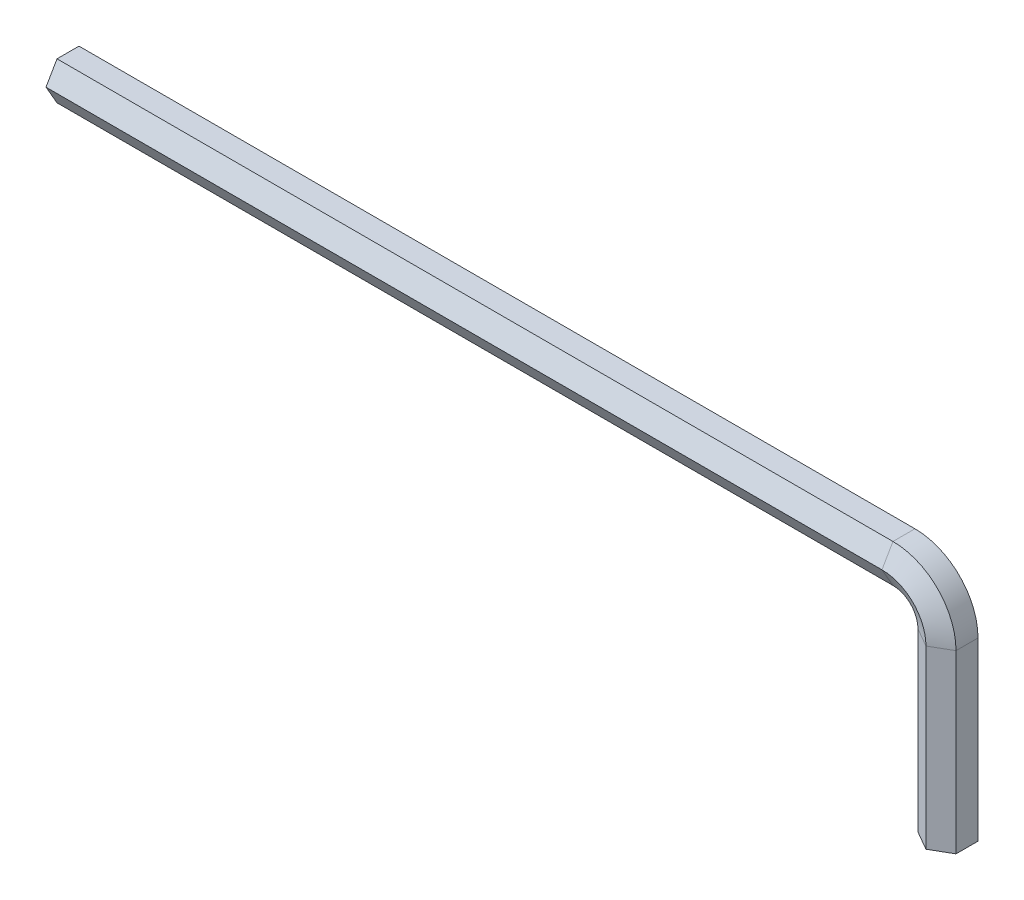
ISO-10303-21;
HEADER;
FILE_DESCRIPTION(('STEP AP214'),'2;1');
FILE_NAME('part.step','',(''),(''),'','','');
FILE_SCHEMA(('AUTOMOTIVE_DESIGN { 1 0 10303 214 1 1 1 1 }'));
ENDSEC;
DATA;
#1=APPLICATION_CONTEXT('core data for automotive mechanical design processes');
#2=APPLICATION_PROTOCOL_DEFINITION('international standard','automotive_design',2000,#1);
#3=PRODUCT_CONTEXT('',#1,'mechanical');
#4=PRODUCT('Part','Part','',(#3));
#5=PRODUCT_RELATED_PRODUCT_CATEGORY('part','',(#4));
#6=PRODUCT_DEFINITION_FORMATION('','',#4);
#7=PRODUCT_DEFINITION_CONTEXT('part definition',#1,'design');
#8=PRODUCT_DEFINITION('design','',#6,#7);
#9=PRODUCT_DEFINITION_SHAPE('','',#8);
#10=(LENGTH_UNIT() NAMED_UNIT(*) SI_UNIT(.MILLI.,.METRE.));
#11=(NAMED_UNIT(*) PLANE_ANGLE_UNIT() SI_UNIT($,.RADIAN.));
#12=(NAMED_UNIT(*) SI_UNIT($,.STERADIAN.) SOLID_ANGLE_UNIT());
#13=UNCERTAINTY_MEASURE_WITH_UNIT(LENGTH_MEASURE(1.E-05),#10,'distance_accuracy_value','');
#14=(GEOMETRIC_REPRESENTATION_CONTEXT(3) GLOBAL_UNCERTAINTY_ASSIGNED_CONTEXT((#13)) GLOBAL_UNIT_ASSIGNED_CONTEXT((#10,
#11,#12)) REPRESENTATION_CONTEXT('',''));
#15=CARTESIAN_POINT('',(0.,0.,0.));
#16=DIRECTION('',(0.,0.,1.));
#17=DIRECTION('',(1.,0.,0.));
#18=AXIS2_PLACEMENT_3D('',#15,#16,#17);
#19=CARTESIAN_POINT('',(0.,0.,0.));
#20=DIRECTION('',(1.,0.,0.));
#21=DIRECTION('',(0.,0.,-1.));
#22=AXIS2_PLACEMENT_3D('',#19,#20,#21);
#23=PLANE('',#22);
#24=DIRECTION('',(0.,0.,-1.));
#25=VECTOR('',#24,1.);
#26=CARTESIAN_POINT('',(0.,-4.3301270189222,2.5));
#27=LINE('',#26,#25);
#28=CARTESIAN_POINT('',(0.,-4.3301270189222,2.5));
#29=VERTEX_POINT('',#28);
#30=CARTESIAN_POINT('',(0.,-4.3301270189222,-2.5));
#31=VERTEX_POINT('',#30);
#32=EDGE_CURVE('E182',#29,#31,#27,.T.);
#33=ORIENTED_EDGE('',*,*,#32,.F.);
#34=DIRECTION('',(0.,-0.866025403784439,-0.5));
#35=VECTOR('',#34,1.);
#36=CARTESIAN_POINT('',(0.,0.,5.));
#37=LINE('',#36,#35);
#38=CARTESIAN_POINT('',(0.,0.,5.));
#39=VERTEX_POINT('',#38);
#40=EDGE_CURVE('E224',#39,#29,#37,.T.);
#41=ORIENTED_EDGE('',*,*,#40,.F.);
#42=DIRECTION('',(0.,-0.866025403784439,0.5));
#43=VECTOR('',#42,1.);
#44=CARTESIAN_POINT('',(0.,4.3301270189222,2.5));
#45=LINE('',#44,#43);
#46=CARTESIAN_POINT('',(0.,4.3301270189222,2.5));
#47=VERTEX_POINT('',#46);
#48=EDGE_CURVE('E211',#47,#39,#45,.T.);
#49=ORIENTED_EDGE('',*,*,#48,.F.);
#50=DIRECTION('',(0.,0.,1.));
#51=VECTOR('',#50,1.);
#52=CARTESIAN_POINT('',(0.,4.3301270189222,-2.5));
#53=LINE('',#52,#51);
#54=CARTESIAN_POINT('',(0.,4.3301270189222,-2.5));
#55=VERTEX_POINT('',#54);
#56=EDGE_CURVE('E134',#55,#47,#53,.T.);
#57=ORIENTED_EDGE('',*,*,#56,.F.);
#58=DIRECTION('',(0.,0.866025403784439,0.5));
#59=VECTOR('',#58,1.);
#60=CARTESIAN_POINT('',(0.,0.,-5.));
#61=LINE('',#60,#59);
#62=CARTESIAN_POINT('',(0.,0.,-5.));
#63=VERTEX_POINT('',#62);
#64=EDGE_CURVE('E138',#63,#55,#61,.T.);
#65=ORIENTED_EDGE('',*,*,#64,.F.);
#66=DIRECTION('',(0.,0.866025403784439,-0.5));
#67=VECTOR('',#66,1.);
#68=CARTESIAN_POINT('',(0.,-4.3301270189222,-2.5));
#69=LINE('',#68,#67);
#70=EDGE_CURVE('E143',#31,#63,#69,.T.);
#71=ORIENTED_EDGE('',*,*,#70,.F.);
#72=EDGE_LOOP('',(#33,#41,#49,#57,#65,#71));
#73=FACE_BOUND('',#72,.T.);
#74=ADVANCED_FACE('F33',(#73),#23,.F.);
#75=CARTESIAN_POINT('',(200.,-50.,0.));
#76=DIRECTION('',(0.,-1.,0.));
#77=DIRECTION('',(0.,0.,-1.));
#78=AXIS2_PLACEMENT_3D('',#75,#76,#77);
#79=PLANE('',#78);
#80=DIRECTION('',(0.,0.,-1.));
#81=VECTOR('',#80,1.);
#82=CARTESIAN_POINT('',(195.669872981078,-50.,2.5));
#83=LINE('',#82,#81);
#84=CARTESIAN_POINT('',(195.669872981078,-50.,2.5));
#85=VERTEX_POINT('',#84);
#86=CARTESIAN_POINT('',(195.669872981078,-50.,-2.5));
#87=VERTEX_POINT('',#86);
#88=EDGE_CURVE('E154',#85,#87,#83,.T.);
#89=ORIENTED_EDGE('',*,*,#88,.T.);
#90=DIRECTION('',(0.866025403784439,0.,-0.5));
#91=VECTOR('',#90,1.);
#92=CARTESIAN_POINT('',(195.669872981078,-50.,-2.5));
#93=LINE('',#92,#91);
#94=CARTESIAN_POINT('',(200.,-50.,-5.));
#95=VERTEX_POINT('',#94);
#96=EDGE_CURVE('E157',#87,#95,#93,.T.);
#97=ORIENTED_EDGE('',*,*,#96,.T.);
#98=DIRECTION('',(0.866025403784439,0.,0.5));
#99=VECTOR('',#98,1.);
#100=CARTESIAN_POINT('',(200.,-50.,-5.));
#101=LINE('',#100,#99);
#102=CARTESIAN_POINT('',(204.330127018922,-50.,-2.5));
#103=VERTEX_POINT('',#102);
#104=EDGE_CURVE('E197',#95,#103,#101,.T.);
#105=ORIENTED_EDGE('',*,*,#104,.T.);
#106=DIRECTION('',(0.,0.,1.));
#107=VECTOR('',#106,1.);
#108=CARTESIAN_POINT('',(204.330127018922,-50.,-2.5));
#109=LINE('',#108,#107);
#110=CARTESIAN_POINT('',(204.330127018922,-50.,2.5));
#111=VERTEX_POINT('',#110);
#112=EDGE_CURVE('E52',#103,#111,#109,.T.);
#113=ORIENTED_EDGE('',*,*,#112,.T.);
#114=DIRECTION('',(-0.866025403784439,0.,0.5));
#115=VECTOR('',#114,1.);
#116=CARTESIAN_POINT('',(204.330127018922,-50.,2.5));
#117=LINE('',#116,#115);
#118=CARTESIAN_POINT('',(200.,-50.,5.));
#119=VERTEX_POINT('',#118);
#120=EDGE_CURVE('E46',#111,#119,#117,.T.);
#121=ORIENTED_EDGE('',*,*,#120,.T.);
#122=DIRECTION('',(-0.866025403784439,0.,-0.5));
#123=VECTOR('',#122,1.);
#124=CARTESIAN_POINT('',(200.,-50.,5.));
#125=LINE('',#124,#123);
#126=EDGE_CURVE('E11',#119,#85,#125,.T.);
#127=ORIENTED_EDGE('',*,*,#126,.T.);
#128=EDGE_LOOP('',(#89,#97,#105,#113,#121,#127));
#129=FACE_BOUND('',#128,.T.);
#130=ADVANCED_FACE('F156',(#129),#79,.T.);
#131=CARTESIAN_POINT('',(0.,-4.3301270189222,2.5));
#132=DIRECTION('',(0.,-1.,0.));
#133=DIRECTION('',(0.,0.,-1.));
#134=AXIS2_PLACEMENT_3D('',#131,#132,#133);
#135=PLANE('',#134);
#136=DIRECTION('',(1.,0.,0.));
#137=VECTOR('',#136,1.);
#138=CARTESIAN_POINT('',(0.,-4.3301270189222,-2.5));
#139=LINE('',#138,#137);
#140=CARTESIAN_POINT('',(190.,-4.3301270189222,-2.5));
#141=VERTEX_POINT('',#140);
#142=EDGE_CURVE('E187',#31,#141,#139,.T.);
#143=ORIENTED_EDGE('',*,*,#142,.T.);
#144=DIRECTION('',(0.,0.,-1.));
#145=VECTOR('',#144,1.);
#146=CARTESIAN_POINT('',(190.,-4.3301270189222,2.5));
#147=LINE('',#146,#145);
#148=CARTESIAN_POINT('',(190.,-4.3301270189222,2.5));
#149=VERTEX_POINT('',#148);
#150=EDGE_CURVE('E256',#149,#141,#147,.T.);
#151=ORIENTED_EDGE('',*,*,#150,.F.);
#152=DIRECTION('',(1.,0.,0.));
#153=VECTOR('',#152,1.);
#154=CARTESIAN_POINT('',(0.,-4.3301270189222,2.5));
#155=LINE('',#154,#153);
#156=EDGE_CURVE('E238',#29,#149,#155,.T.);
#157=ORIENTED_EDGE('',*,*,#156,.F.);
#158=ORIENTED_EDGE('',*,*,#32,.T.);
#159=EDGE_LOOP('',(#143,#151,#157,#158));
#160=FACE_BOUND('',#159,.T.);
#161=ADVANCED_FACE('F263',(#160),#135,.T.);
#162=CARTESIAN_POINT('',(0.,-4.3301270189222,-2.5));
#163=DIRECTION('',(0.,-0.5,-0.866025403784439));
#164=DIRECTION('',(0.,0.866025403784439,-0.5));
#165=AXIS2_PLACEMENT_3D('',#162,#163,#164);
#166=PLANE('',#165);
#167=DIRECTION('',(1.,0.,0.));
#168=VECTOR('',#167,1.);
#169=CARTESIAN_POINT('',(0.,0.,-5.));
#170=LINE('',#169,#168);
#171=CARTESIAN_POINT('',(190.,0.,-5.));
#172=VERTEX_POINT('',#171);
#173=EDGE_CURVE('E186',#63,#172,#170,.T.);
#174=ORIENTED_EDGE('',*,*,#173,.T.);
#175=DIRECTION('',(0.,0.866025403784439,-0.5));
#176=VECTOR('',#175,1.);
#177=CARTESIAN_POINT('',(190.,-4.3301270189222,-2.5));
#178=LINE('',#177,#176);
#179=EDGE_CURVE('E183',#141,#172,#178,.T.);
#180=ORIENTED_EDGE('',*,*,#179,.F.);
#181=ORIENTED_EDGE('',*,*,#142,.F.);
#182=ORIENTED_EDGE('',*,*,#70,.T.);
#183=EDGE_LOOP('',(#174,#180,#181,#182));
#184=FACE_BOUND('',#183,.T.);
#185=ADVANCED_FACE('F266',(#184),#166,.T.);
#186=CARTESIAN_POINT('',(0.,0.,-5.));
#187=DIRECTION('',(0.,0.5,-0.866025403784439));
#188=DIRECTION('',(0.,0.866025403784439,0.5));
#189=AXIS2_PLACEMENT_3D('',#186,#187,#188);
#190=PLANE('',#189);
#191=DIRECTION('',(1.,0.,0.));
#192=VECTOR('',#191,1.);
#193=CARTESIAN_POINT('',(0.,4.3301270189222,-2.5));
#194=LINE('',#193,#192);
#195=CARTESIAN_POINT('',(190.,4.3301270189222,-2.5));
#196=VERTEX_POINT('',#195);
#197=EDGE_CURVE('E200',#55,#196,#194,.T.);
#198=ORIENTED_EDGE('',*,*,#197,.T.);
#199=DIRECTION('',(0.,0.866025403784439,0.5));
#200=VECTOR('',#199,1.);
#201=CARTESIAN_POINT('',(190.,0.,-5.));
#202=LINE('',#201,#200);
#203=EDGE_CURVE('E190',#172,#196,#202,.T.);
#204=ORIENTED_EDGE('',*,*,#203,.F.);
#205=ORIENTED_EDGE('',*,*,#173,.F.);
#206=ORIENTED_EDGE('',*,*,#64,.T.);
#207=EDGE_LOOP('',(#198,#204,#205,#206));
#208=FACE_BOUND('',#207,.T.);
#209=ADVANCED_FACE('F320',(#208),#190,.T.);
#210=CARTESIAN_POINT('',(0.,4.3301270189222,-2.5));
#211=DIRECTION('',(0.,1.,0.));
#212=DIRECTION('',(0.,0.,1.));
#213=AXIS2_PLACEMENT_3D('',#210,#211,#212);
#214=PLANE('',#213);
#215=DIRECTION('',(1.,0.,0.));
#216=VECTOR('',#215,1.);
#217=CARTESIAN_POINT('',(0.,4.3301270189222,2.5));
#218=LINE('',#217,#216);
#219=CARTESIAN_POINT('',(190.,4.3301270189222,2.5));
#220=VERTEX_POINT('',#219);
#221=EDGE_CURVE('E213',#47,#220,#218,.T.);
#222=ORIENTED_EDGE('',*,*,#221,.T.);
#223=DIRECTION('',(0.,0.,1.));
#224=VECTOR('',#223,1.);
#225=CARTESIAN_POINT('',(190.,4.3301270189222,-2.5));
#226=LINE('',#225,#224);
#227=EDGE_CURVE('E203',#196,#220,#226,.T.);
#228=ORIENTED_EDGE('',*,*,#227,.F.);
#229=ORIENTED_EDGE('',*,*,#197,.F.);
#230=ORIENTED_EDGE('',*,*,#56,.T.);
#231=EDGE_LOOP('',(#222,#228,#229,#230));
#232=FACE_BOUND('',#231,.T.);
#233=ADVANCED_FACE('F328',(#232),#214,.T.);
#234=CARTESIAN_POINT('',(0.,4.3301270189222,2.5));
#235=DIRECTION('',(0.,0.5,0.866025403784439));
#236=DIRECTION('',(0.,-0.866025403784439,0.5));
#237=AXIS2_PLACEMENT_3D('',#234,#235,#236);
#238=PLANE('',#237);
#239=DIRECTION('',(1.,0.,0.));
#240=VECTOR('',#239,1.);
#241=CARTESIAN_POINT('',(0.,0.,5.));
#242=LINE('',#241,#240);
#243=CARTESIAN_POINT('',(190.,0.,5.));
#244=VERTEX_POINT('',#243);
#245=EDGE_CURVE('E226',#39,#244,#242,.T.);
#246=ORIENTED_EDGE('',*,*,#245,.T.);
#247=DIRECTION('',(0.,-0.866025403784439,0.5));
#248=VECTOR('',#247,1.);
#249=CARTESIAN_POINT('',(190.,4.3301270189222,2.5));
#250=LINE('',#249,#248);
#251=EDGE_CURVE('E216',#220,#244,#250,.T.);
#252=ORIENTED_EDGE('',*,*,#251,.F.);
#253=ORIENTED_EDGE('',*,*,#221,.F.);
#254=ORIENTED_EDGE('',*,*,#48,.T.);
#255=EDGE_LOOP('',(#246,#252,#253,#254));
#256=FACE_BOUND('',#255,.T.);
#257=ADVANCED_FACE('F338',(#256),#238,.T.);
#258=CARTESIAN_POINT('',(0.,0.,5.));
#259=DIRECTION('',(0.,-0.5,0.866025403784439));
#260=DIRECTION('',(0.,-0.866025403784439,-0.5));
#261=AXIS2_PLACEMENT_3D('',#258,#259,#260);
#262=PLANE('',#261);
#263=DIRECTION('',(0.,-0.866025403784439,-0.5));
#264=VECTOR('',#263,1.);
#265=CARTESIAN_POINT('',(190.,0.,5.));
#266=LINE('',#265,#264);
#267=EDGE_CURVE('E229',#244,#149,#266,.T.);
#268=ORIENTED_EDGE('',*,*,#267,.F.);
#269=ORIENTED_EDGE('',*,*,#245,.F.);
#270=ORIENTED_EDGE('',*,*,#40,.T.);
#271=ORIENTED_EDGE('',*,*,#156,.T.);
#272=EDGE_LOOP('',(#268,#269,#270,#271));
#273=FACE_BOUND('',#272,.T.);
#274=ADVANCED_FACE('F279',(#273),#262,.T.);
#275=CARTESIAN_POINT('',(190.,-10.,0.));
#276=DIRECTION('',(0.,0.,-1.));
#277=DIRECTION('',(-1.,0.,0.));
#278=AXIS2_PLACEMENT_3D('',#275,#276,#277);
#279=CYLINDRICAL_SURFACE('',#278,5.66987298107781);
#280=CARTESIAN_POINT('',(190.,-10.,-2.5));
#281=DIRECTION('',(0.,0.,-1.));
#282=DIRECTION('',(0.,1.,0.));
#283=AXIS2_PLACEMENT_3D('',#280,#281,#282);
#284=CIRCLE('',#283,5.66987298107781);
#285=CARTESIAN_POINT('',(195.669872981078,-10.,-2.5));
#286=VERTEX_POINT('',#285);
#287=EDGE_CURVE('E193',#141,#286,#284,.T.);
#288=ORIENTED_EDGE('',*,*,#287,.T.);
#289=DIRECTION('',(0.,0.,-1.));
#290=VECTOR('',#289,1.);
#291=CARTESIAN_POINT('',(195.669872981078,-10.,2.5));
#292=LINE('',#291,#290);
#293=CARTESIAN_POINT('',(195.669872981078,-10.,2.5));
#294=VERTEX_POINT('',#293);
#295=EDGE_CURVE('E175',#294,#286,#292,.T.);
#296=ORIENTED_EDGE('',*,*,#295,.F.);
#297=CARTESIAN_POINT('',(190.,-10.,2.5));
#298=DIRECTION('',(0.,0.,-1.));
#299=DIRECTION('',(0.,1.,0.));
#300=AXIS2_PLACEMENT_3D('',#297,#298,#299);
#301=CIRCLE('',#300,5.66987298107781);
#302=EDGE_CURVE('E240',#149,#294,#301,.T.);
#303=ORIENTED_EDGE('',*,*,#302,.F.);
#304=ORIENTED_EDGE('',*,*,#150,.T.);
#305=EDGE_LOOP('',(#288,#296,#303,#304));
#306=FACE_BOUND('',#305,.T.);
#307=ADVANCED_FACE('F246',(#306),#279,.F.);
#308=CARTESIAN_POINT('',(190.,-10.,-2.5));
#309=DIRECTION('',(0.,0.,-1.));
#310=DIRECTION('',(-1.,0.,0.));
#311=AXIS2_PLACEMENT_3D('',#308,#309,#310);
#312=CONICAL_SURFACE('',#311,5.66987298107781,1.0471975511966);
#313=CARTESIAN_POINT('',(190.,-10.,-5.));
#314=DIRECTION('',(0.,0.,-1.));
#315=DIRECTION('',(0.,1.,0.));
#316=AXIS2_PLACEMENT_3D('',#313,#314,#315);
#317=CIRCLE('',#316,10.);
#318=CARTESIAN_POINT('',(200.,-10.,-5.));
#319=VERTEX_POINT('',#318);
#320=EDGE_CURVE('E121',#172,#319,#317,.T.);
#321=ORIENTED_EDGE('',*,*,#320,.T.);
#322=DIRECTION('',(0.866025403784439,0.,-0.5));
#323=VECTOR('',#322,1.);
#324=CARTESIAN_POINT('',(195.669872981078,-10.,-2.5));
#325=LINE('',#324,#323);
#326=EDGE_CURVE('E191',#286,#319,#325,.T.);
#327=ORIENTED_EDGE('',*,*,#326,.F.);
#328=ORIENTED_EDGE('',*,*,#287,.F.);
#329=ORIENTED_EDGE('',*,*,#179,.T.);
#330=EDGE_LOOP('',(#321,#327,#328,#329));
#331=FACE_BOUND('',#330,.T.);
#332=ADVANCED_FACE('F269',(#331),#312,.F.);
#333=CARTESIAN_POINT('',(190.,-10.,-5.));
#334=DIRECTION('',(0.,0.,1.));
#335=DIRECTION('',(1.,0.,0.));
#336=AXIS2_PLACEMENT_3D('',#333,#334,#335);
#337=CONICAL_SURFACE('',#336,10.,1.0471975511966);
#338=CARTESIAN_POINT('',(190.,-10.,-2.5));
#339=DIRECTION('',(0.,0.,-1.));
#340=DIRECTION('',(0.,1.,0.));
#341=AXIS2_PLACEMENT_3D('',#338,#339,#340);
#342=CIRCLE('',#341,14.3301270189222);
#343=CARTESIAN_POINT('',(204.330127018922,-10.,-2.5));
#344=VERTEX_POINT('',#343);
#345=EDGE_CURVE('E112',#196,#344,#342,.T.);
#346=ORIENTED_EDGE('',*,*,#345,.T.);
#347=DIRECTION('',(0.866025403784439,0.,0.5));
#348=VECTOR('',#347,1.);
#349=CARTESIAN_POINT('',(200.,-10.,-5.));
#350=LINE('',#349,#348);
#351=EDGE_CURVE('E194',#319,#344,#350,.T.);
#352=ORIENTED_EDGE('',*,*,#351,.F.);
#353=ORIENTED_EDGE('',*,*,#320,.F.);
#354=ORIENTED_EDGE('',*,*,#203,.T.);
#355=EDGE_LOOP('',(#346,#352,#353,#354));
#356=FACE_BOUND('',#355,.T.);
#357=ADVANCED_FACE('F271',(#356),#337,.T.);
#358=CARTESIAN_POINT('',(190.,-10.,0.));
#359=DIRECTION('',(0.,0.,-1.));
#360=DIRECTION('',(-1.,0.,0.));
#361=AXIS2_PLACEMENT_3D('',#358,#359,#360);
#362=CYLINDRICAL_SURFACE('',#361,14.3301270189222);
#363=CARTESIAN_POINT('',(190.,-10.,2.5));
#364=DIRECTION('',(0.,0.,-1.));
#365=DIRECTION('',(0.,1.,0.));
#366=AXIS2_PLACEMENT_3D('',#363,#364,#365);
#367=CIRCLE('',#366,14.3301270189222);
#368=CARTESIAN_POINT('',(204.330127018922,-10.,2.5));
#369=VERTEX_POINT('',#368);
#370=EDGE_CURVE('E105',#220,#369,#367,.T.);
#371=ORIENTED_EDGE('',*,*,#370,.T.);
#372=DIRECTION('',(0.,0.,1.));
#373=VECTOR('',#372,1.);
#374=CARTESIAN_POINT('',(204.330127018922,-10.,-2.5));
#375=LINE('',#374,#373);
#376=EDGE_CURVE('E207',#344,#369,#375,.T.);
#377=ORIENTED_EDGE('',*,*,#376,.F.);
#378=ORIENTED_EDGE('',*,*,#345,.F.);
#379=ORIENTED_EDGE('',*,*,#227,.T.);
#380=EDGE_LOOP('',(#371,#377,#378,#379));
#381=FACE_BOUND('',#380,.T.);
#382=ADVANCED_FACE('F277',(#381),#362,.T.);
#383=CARTESIAN_POINT('',(190.,-10.,2.5));
#384=DIRECTION('',(0.,0.,-1.));
#385=DIRECTION('',(-1.,0.,0.));
#386=AXIS2_PLACEMENT_3D('',#383,#384,#385);
#387=CONICAL_SURFACE('',#386,14.3301270189222,1.0471975511966);
#388=CARTESIAN_POINT('',(190.,-10.,5.));
#389=DIRECTION('',(0.,0.,-1.));
#390=DIRECTION('',(0.,1.,0.));
#391=AXIS2_PLACEMENT_3D('',#388,#389,#390);
#392=CIRCLE('',#391,10.);
#393=CARTESIAN_POINT('',(200.,-10.,5.));
#394=VERTEX_POINT('',#393);
#395=EDGE_CURVE('E231',#244,#394,#392,.T.);
#396=ORIENTED_EDGE('',*,*,#395,.T.);
#397=DIRECTION('',(-0.866025403784439,0.,0.5));
#398=VECTOR('',#397,1.);
#399=CARTESIAN_POINT('',(204.330127018922,-10.,2.5));
#400=LINE('',#399,#398);
#401=EDGE_CURVE('E219',#369,#394,#400,.T.);
#402=ORIENTED_EDGE('',*,*,#401,.F.);
#403=ORIENTED_EDGE('',*,*,#370,.F.);
#404=ORIENTED_EDGE('',*,*,#251,.T.);
#405=EDGE_LOOP('',(#396,#402,#403,#404));
#406=FACE_BOUND('',#405,.T.);
#407=ADVANCED_FACE('F381',(#406),#387,.T.);
#408=CARTESIAN_POINT('',(190.,-10.,5.));
#409=DIRECTION('',(0.,0.,1.));
#410=DIRECTION('',(1.,0.,0.));
#411=AXIS2_PLACEMENT_3D('',#408,#409,#410);
#412=CONICAL_SURFACE('',#411,10.,1.0471975511966);
#413=DIRECTION('',(-0.866025403784439,0.,-0.5));
#414=VECTOR('',#413,1.);
#415=CARTESIAN_POINT('',(200.,-10.,5.));
#416=LINE('',#415,#414);
#417=EDGE_CURVE('E180',#394,#294,#416,.T.);
#418=ORIENTED_EDGE('',*,*,#417,.F.);
#419=ORIENTED_EDGE('',*,*,#395,.F.);
#420=ORIENTED_EDGE('',*,*,#267,.T.);
#421=ORIENTED_EDGE('',*,*,#302,.T.);
#422=EDGE_LOOP('',(#418,#419,#420,#421));
#423=FACE_BOUND('',#422,.T.);
#424=ADVANCED_FACE('F249',(#423),#412,.F.);
#425=CARTESIAN_POINT('',(195.669872981078,-10.0000000000001,2.5));
#426=DIRECTION('',(-1.,0.,0.));
#427=DIRECTION('',(0.,0.,1.));
#428=AXIS2_PLACEMENT_3D('',#425,#426,#427);
#429=PLANE('',#428);
#430=DIRECTION('',(0.,-1.,0.));
#431=VECTOR('',#430,1.);
#432=CARTESIAN_POINT('',(195.669872981078,-10.0000000000001,-2.5));
#433=LINE('',#432,#431);
#434=EDGE_CURVE('E162',#286,#87,#433,.T.);
#435=ORIENTED_EDGE('',*,*,#434,.T.);
#436=ORIENTED_EDGE('',*,*,#88,.F.);
#437=DIRECTION('',(0.,-1.,0.));
#438=VECTOR('',#437,1.);
#439=CARTESIAN_POINT('',(195.669872981078,-10.0000000000001,2.5));
#440=LINE('',#439,#438);
#441=EDGE_CURVE('E163',#294,#85,#440,.T.);
#442=ORIENTED_EDGE('',*,*,#441,.F.);
#443=ORIENTED_EDGE('',*,*,#295,.T.);
#444=EDGE_LOOP('',(#435,#436,#442,#443));
#445=FACE_BOUND('',#444,.T.);
#446=ADVANCED_FACE('F173',(#445),#429,.T.);
#447=CARTESIAN_POINT('',(195.669872981078,-10.0000000000001,-2.5));
#448=DIRECTION('',(-0.5,0.,-0.866025403784439));
#449=DIRECTION('',(-0.866025403784439,0.,0.5));
#450=AXIS2_PLACEMENT_3D('',#447,#448,#449);
#451=PLANE('',#450);
#452=DIRECTION('',(0.,-1.,0.));
#453=VECTOR('',#452,1.);
#454=CARTESIAN_POINT('',(200.,-10.0000000000001,-5.));
#455=LINE('',#454,#453);
#456=EDGE_CURVE('E170',#319,#95,#455,.T.);
#457=ORIENTED_EDGE('',*,*,#456,.T.);
#458=ORIENTED_EDGE('',*,*,#96,.F.);
#459=ORIENTED_EDGE('',*,*,#434,.F.);
#460=ORIENTED_EDGE('',*,*,#326,.T.);
#461=EDGE_LOOP('',(#457,#458,#459,#460));
#462=FACE_BOUND('',#461,.T.);
#463=ADVANCED_FACE('F167',(#462),#451,.T.);
#464=CARTESIAN_POINT('',(200.,-10.0000000000001,-5.));
#465=DIRECTION('',(0.5,0.,-0.866025403784439));
#466=DIRECTION('',(-0.866025403784439,0.,-0.5));
#467=AXIS2_PLACEMENT_3D('',#464,#465,#466);
#468=PLANE('',#467);
#469=DIRECTION('',(0.,-1.,0.));
#470=VECTOR('',#469,1.);
#471=CARTESIAN_POINT('',(204.330127018922,-10.0000000000001,-2.5));
#472=LINE('',#471,#470);
#473=EDGE_CURVE('E90',#344,#103,#472,.T.);
#474=ORIENTED_EDGE('',*,*,#473,.T.);
#475=ORIENTED_EDGE('',*,*,#104,.F.);
#476=ORIENTED_EDGE('',*,*,#456,.F.);
#477=ORIENTED_EDGE('',*,*,#351,.T.);
#478=EDGE_LOOP('',(#474,#475,#476,#477));
#479=FACE_BOUND('',#478,.T.);
#480=ADVANCED_FACE('F413',(#479),#468,.T.);
#481=CARTESIAN_POINT('',(204.330127018922,-10.0000000000001,-2.5));
#482=DIRECTION('',(1.,0.,0.));
#483=DIRECTION('',(0.,0.,-1.));
#484=AXIS2_PLACEMENT_3D('',#481,#482,#483);
#485=PLANE('',#484);
#486=DIRECTION('',(0.,-1.,0.));
#487=VECTOR('',#486,1.);
#488=CARTESIAN_POINT('',(204.330127018922,-10.0000000000001,2.5));
#489=LINE('',#488,#487);
#490=EDGE_CURVE('E82',#369,#111,#489,.T.);
#491=ORIENTED_EDGE('',*,*,#490,.T.);
#492=ORIENTED_EDGE('',*,*,#112,.F.);
#493=ORIENTED_EDGE('',*,*,#473,.F.);
#494=ORIENTED_EDGE('',*,*,#376,.T.);
#495=EDGE_LOOP('',(#491,#492,#493,#494));
#496=FACE_BOUND('',#495,.T.);
#497=ADVANCED_FACE('F289',(#496),#485,.T.);
#498=CARTESIAN_POINT('',(204.330127018922,-10.0000000000001,2.5));
#499=DIRECTION('',(0.5,0.,0.866025403784439));
#500=DIRECTION('',(0.866025403784439,0.,-0.5));
#501=AXIS2_PLACEMENT_3D('',#498,#499,#500);
#502=PLANE('',#501);
#503=DIRECTION('',(0.,-1.,0.));
#504=VECTOR('',#503,1.);
#505=CARTESIAN_POINT('',(200.,-10.0000000000001,5.));
#506=LINE('',#505,#504);
#507=EDGE_CURVE('E40',#394,#119,#506,.T.);
#508=ORIENTED_EDGE('',*,*,#507,.T.);
#509=ORIENTED_EDGE('',*,*,#120,.F.);
#510=ORIENTED_EDGE('',*,*,#490,.F.);
#511=ORIENTED_EDGE('',*,*,#401,.T.);
#512=EDGE_LOOP('',(#508,#509,#510,#511));
#513=FACE_BOUND('',#512,.T.);
#514=ADVANCED_FACE('F284',(#513),#502,.T.);
#515=CARTESIAN_POINT('',(200.,-10.0000000000001,5.));
#516=DIRECTION('',(-0.5,0.,0.866025403784439));
#517=DIRECTION('',(0.866025403784439,0.,0.5));
#518=AXIS2_PLACEMENT_3D('',#515,#516,#517);
#519=PLANE('',#518);
#520=ORIENTED_EDGE('',*,*,#126,.F.);
#521=ORIENTED_EDGE('',*,*,#507,.F.);
#522=ORIENTED_EDGE('',*,*,#417,.T.);
#523=ORIENTED_EDGE('',*,*,#441,.T.);
#524=EDGE_LOOP('',(#520,#521,#522,#523));
#525=FACE_BOUND('',#524,.T.);
#526=ADVANCED_FACE('F241',(#525),#519,.T.);
#527=CLOSED_SHELL('',(#74,#130,#161,#185,#209,#233,#257,#274,#307,#332,#357,#382,#407,#424,#446,
#463,#480,#497,#514,#526));
#528=MANIFOLD_SOLID_BREP('B2',#527);
#529=ADVANCED_BREP_SHAPE_REPRESENTATION('',(#18,#528),#14);
#530=SHAPE_DEFINITION_REPRESENTATION(#9,#529);
ENDSEC;
END-ISO-10303-21;
